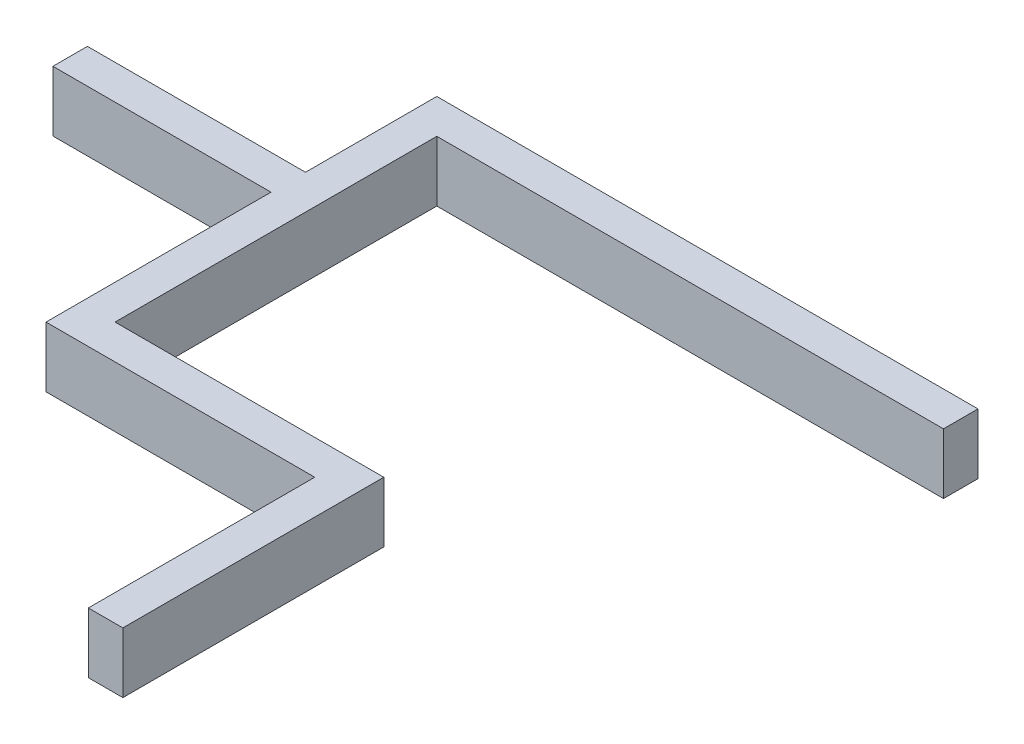
ISO-10303-21;
HEADER;
FILE_DESCRIPTION(('STEP AP214'),'2;1');
FILE_NAME('part.step','',(''),(''),'','','');
FILE_SCHEMA(('AUTOMOTIVE_DESIGN { 1 0 10303 214 1 1 1 1 }'));
ENDSEC;
DATA;
#1=APPLICATION_CONTEXT('core data for automotive mechanical design processes');
#2=APPLICATION_PROTOCOL_DEFINITION('international standard','automotive_design',2000,#1);
#3=PRODUCT_CONTEXT('',#1,'mechanical');
#4=PRODUCT('Part','Part','',(#3));
#5=PRODUCT_RELATED_PRODUCT_CATEGORY('part','',(#4));
#6=PRODUCT_DEFINITION_FORMATION('','',#4);
#7=PRODUCT_DEFINITION_CONTEXT('part definition',#1,'design');
#8=PRODUCT_DEFINITION('design','',#6,#7);
#9=PRODUCT_DEFINITION_SHAPE('','',#8);
#10=(LENGTH_UNIT() NAMED_UNIT(*) SI_UNIT(.MILLI.,.METRE.));
#11=(NAMED_UNIT(*) PLANE_ANGLE_UNIT() SI_UNIT($,.RADIAN.));
#12=(NAMED_UNIT(*) SI_UNIT($,.STERADIAN.) SOLID_ANGLE_UNIT());
#13=UNCERTAINTY_MEASURE_WITH_UNIT(LENGTH_MEASURE(1.E-05),#10,'distance_accuracy_value','');
#14=(GEOMETRIC_REPRESENTATION_CONTEXT(3) GLOBAL_UNCERTAINTY_ASSIGNED_CONTEXT((#13)) GLOBAL_UNIT_ASSIGNED_CONTEXT((#10,
#11,#12)) REPRESENTATION_CONTEXT('',''));
#15=CARTESIAN_POINT('',(0.,0.,0.));
#16=DIRECTION('',(0.,0.,1.));
#17=DIRECTION('',(1.,0.,0.));
#18=AXIS2_PLACEMENT_3D('',#15,#16,#17);
#19=CARTESIAN_POINT('',(77.2931425865469,8.5,3.47679166005444));
#20=DIRECTION('',(1.,0.,0.));
#21=DIRECTION('',(0.,0.,-1.));
#22=AXIS2_PLACEMENT_3D('',#19,#20,#21);
#23=PLANE('',#22);
#24=DIRECTION('',(0.,0.,1.));
#25=VECTOR('',#24,1.);
#26=CARTESIAN_POINT('',(77.2931425865469,1.5,3.47679166005444));
#27=LINE('',#26,#25);
#28=CARTESIAN_POINT('',(77.2931425865469,1.5,-11.7372666128108));
#29=VERTEX_POINT('',#28);
#30=CARTESIAN_POINT('',(77.2931425865469,1.5,3.47679166005444));
#31=VERTEX_POINT('',#30);
#32=EDGE_CURVE('E230',#29,#31,#27,.T.);
#33=ORIENTED_EDGE('',*,*,#32,.T.);
#34=DIRECTION('',(0.,-1.,0.));
#35=VECTOR('',#34,1.);
#36=CARTESIAN_POINT('',(77.2931425865469,8.5,3.47679166005444));
#37=LINE('',#36,#35);
#38=CARTESIAN_POINT('',(77.2931425865469,8.5,3.47679166005444));
#39=VERTEX_POINT('',#38);
#40=EDGE_CURVE('E194',#39,#31,#37,.T.);
#41=ORIENTED_EDGE('',*,*,#40,.F.);
#42=DIRECTION('',(0.,0.,1.));
#43=VECTOR('',#42,1.);
#44=CARTESIAN_POINT('',(77.2931425865469,8.5,3.47679166005444));
#45=LINE('',#44,#43);
#46=CARTESIAN_POINT('',(77.2931425865469,8.5,-11.7372666128108));
#47=VERTEX_POINT('',#46);
#48=EDGE_CURVE('E204',#47,#39,#45,.T.);
#49=ORIENTED_EDGE('',*,*,#48,.F.);
#50=DIRECTION('',(0.,-1.,0.));
#51=VECTOR('',#50,1.);
#52=CARTESIAN_POINT('',(77.2931425865469,8.5,-11.7372666128108));
#53=LINE('',#52,#51);
#54=EDGE_CURVE('E197',#47,#29,#53,.T.);
#55=ORIENTED_EDGE('',*,*,#54,.T.);
#56=EDGE_LOOP('',(#33,#41,#49,#55));
#57=FACE_BOUND('',#56,.T.);
#58=ADVANCED_FACE('F45',(#57),#23,.F.);
#59=CARTESIAN_POINT('',(52.0277518293071,8.5,3.47679166005444));
#60=DIRECTION('',(0.,0.,1.));
#61=DIRECTION('',(1.,0.,0.));
#62=AXIS2_PLACEMENT_3D('',#59,#60,#61);
#63=PLANE('',#62);
#64=DIRECTION('',(-1.,0.,0.));
#65=VECTOR('',#64,1.);
#66=CARTESIAN_POINT('',(52.0277518293071,1.5,3.47679166005444));
#67=LINE('',#66,#65);
#68=CARTESIAN_POINT('',(52.0277518293071,1.5,3.47679166005444));
#69=VERTEX_POINT('',#68);
#70=EDGE_CURVE('E233',#31,#69,#67,.T.);
#71=ORIENTED_EDGE('',*,*,#70,.T.);
#72=DIRECTION('',(0.,-1.,0.));
#73=VECTOR('',#72,1.);
#74=CARTESIAN_POINT('',(52.0277518293071,8.5,3.47679166005444));
#75=LINE('',#74,#73);
#76=CARTESIAN_POINT('',(52.0277518293071,8.5,3.47679166005444));
#77=VERTEX_POINT('',#76);
#78=EDGE_CURVE('E191',#77,#69,#75,.T.);
#79=ORIENTED_EDGE('',*,*,#78,.F.);
#80=DIRECTION('',(-1.,0.,0.));
#81=VECTOR('',#80,1.);
#82=CARTESIAN_POINT('',(52.0277518293071,8.5,3.47679166005444));
#83=LINE('',#82,#81);
#84=EDGE_CURVE('E210',#39,#77,#83,.T.);
#85=ORIENTED_EDGE('',*,*,#84,.F.);
#86=ORIENTED_EDGE('',*,*,#40,.T.);
#87=EDGE_LOOP('',(#71,#79,#85,#86));
#88=FACE_BOUND('',#87,.T.);
#89=ADVANCED_FACE('F296',(#88),#63,.F.);
#90=CARTESIAN_POINT('',(52.0277518293071,8.5,7.47679166005445));
#91=DIRECTION('',(1.,0.,0.));
#92=DIRECTION('',(0.,0.,-1.));
#93=AXIS2_PLACEMENT_3D('',#90,#91,#92);
#94=PLANE('',#93);
#95=DIRECTION('',(0.,0.,1.));
#96=VECTOR('',#95,1.);
#97=CARTESIAN_POINT('',(52.0277518293071,1.5,7.47679166005445));
#98=LINE('',#97,#96);
#99=CARTESIAN_POINT('',(52.0277518293071,1.5,7.47679166005445));
#100=VERTEX_POINT('',#99);
#101=EDGE_CURVE('E236',#69,#100,#98,.T.);
#102=ORIENTED_EDGE('',*,*,#101,.T.);
#103=DIRECTION('',(0.,-1.,0.));
#104=VECTOR('',#103,1.);
#105=CARTESIAN_POINT('',(52.0277518293071,8.5,7.47679166005445));
#106=LINE('',#105,#104);
#107=CARTESIAN_POINT('',(52.0277518293071,8.5,7.47679166005445));
#108=VERTEX_POINT('',#107);
#109=EDGE_CURVE('E188',#108,#100,#106,.T.);
#110=ORIENTED_EDGE('',*,*,#109,.F.);
#111=DIRECTION('',(0.,0.,1.));
#112=VECTOR('',#111,1.);
#113=CARTESIAN_POINT('',(52.0277518293071,8.5,7.47679166005445));
#114=LINE('',#113,#112);
#115=EDGE_CURVE('E212',#77,#108,#114,.T.);
#116=ORIENTED_EDGE('',*,*,#115,.F.);
#117=ORIENTED_EDGE('',*,*,#78,.T.);
#118=EDGE_LOOP('',(#102,#110,#116,#117));
#119=FACE_BOUND('',#118,.T.);
#120=ADVANCED_FACE('F293',(#119),#94,.F.);
#121=CARTESIAN_POINT('',(77.2931425865469,8.5,7.47679166005444));
#122=DIRECTION('',(0.,0.,-1.));
#123=DIRECTION('',(-1.,0.,0.));
#124=AXIS2_PLACEMENT_3D('',#121,#122,#123);
#125=PLANE('',#124);
#126=DIRECTION('',(1.,0.,0.));
#127=VECTOR('',#126,1.);
#128=CARTESIAN_POINT('',(77.2931425865469,1.5,7.47679166005444));
#129=LINE('',#128,#127);
#130=CARTESIAN_POINT('',(77.2931425865469,1.5,7.47679166005444));
#131=VERTEX_POINT('',#130);
#132=EDGE_CURVE('E239',#100,#131,#129,.T.);
#133=ORIENTED_EDGE('',*,*,#132,.T.);
#134=DIRECTION('',(0.,-1.,0.));
#135=VECTOR('',#134,1.);
#136=CARTESIAN_POINT('',(77.2931425865469,8.5,7.47679166005444));
#137=LINE('',#136,#135);
#138=CARTESIAN_POINT('',(77.2931425865469,8.5,7.47679166005444));
#139=VERTEX_POINT('',#138);
#140=EDGE_CURVE('E185',#139,#131,#137,.T.);
#141=ORIENTED_EDGE('',*,*,#140,.F.);
#142=DIRECTION('',(1.,0.,0.));
#143=VECTOR('',#142,1.);
#144=CARTESIAN_POINT('',(77.2931425865469,8.5,7.47679166005444));
#145=LINE('',#144,#143);
#146=EDGE_CURVE('E214',#108,#139,#145,.T.);
#147=ORIENTED_EDGE('',*,*,#146,.F.);
#148=ORIENTED_EDGE('',*,*,#109,.T.);
#149=EDGE_LOOP('',(#133,#141,#147,#148));
#150=FACE_BOUND('',#149,.T.);
#151=ADVANCED_FACE('F288',(#150),#125,.F.);
#152=CARTESIAN_POINT('',(77.2931425865469,8.5,33.5435448342302));
#153=DIRECTION('',(1.,0.,0.));
#154=DIRECTION('',(0.,0.,-1.));
#155=AXIS2_PLACEMENT_3D('',#152,#153,#154);
#156=PLANE('',#155);
#157=DIRECTION('',(0.,0.,1.));
#158=VECTOR('',#157,1.);
#159=CARTESIAN_POINT('',(77.2931425865469,1.5,33.5435448342302));
#160=LINE('',#159,#158);
#161=CARTESIAN_POINT('',(77.2931425865469,1.5,33.5435448342302));
#162=VERTEX_POINT('',#161);
#163=EDGE_CURVE('E242',#131,#162,#160,.T.);
#164=ORIENTED_EDGE('',*,*,#163,.T.);
#165=DIRECTION('',(0.,-1.,0.));
#166=VECTOR('',#165,1.);
#167=CARTESIAN_POINT('',(77.2931425865469,8.5,33.5435448342302));
#168=LINE('',#167,#166);
#169=CARTESIAN_POINT('',(77.2931425865469,8.5,33.5435448342302));
#170=VERTEX_POINT('',#169);
#171=EDGE_CURVE('E182',#170,#162,#168,.T.);
#172=ORIENTED_EDGE('',*,*,#171,.F.);
#173=DIRECTION('',(0.,0.,1.));
#174=VECTOR('',#173,1.);
#175=CARTESIAN_POINT('',(77.2931425865469,8.5,33.5435448342302));
#176=LINE('',#175,#174);
#177=EDGE_CURVE('E216',#139,#170,#176,.T.);
#178=ORIENTED_EDGE('',*,*,#177,.F.);
#179=ORIENTED_EDGE('',*,*,#140,.T.);
#180=EDGE_LOOP('',(#164,#172,#178,#179));
#181=FACE_BOUND('',#180,.T.);
#182=ADVANCED_FACE('F285',(#181),#156,.F.);
#183=CARTESIAN_POINT('',(108.431248518344,8.5,33.5435448342302));
#184=DIRECTION('',(0.,0.,-1.));
#185=DIRECTION('',(-1.,0.,0.));
#186=AXIS2_PLACEMENT_3D('',#183,#184,#185);
#187=PLANE('',#186);
#188=DIRECTION('',(1.,0.,0.));
#189=VECTOR('',#188,1.);
#190=CARTESIAN_POINT('',(108.431248518344,1.5,33.5435448342302));
#191=LINE('',#190,#189);
#192=CARTESIAN_POINT('',(108.431248518344,1.5,33.5435448342302));
#193=VERTEX_POINT('',#192);
#194=EDGE_CURVE('E245',#162,#193,#191,.T.);
#195=ORIENTED_EDGE('',*,*,#194,.T.);
#196=DIRECTION('',(0.,-1.,0.));
#197=VECTOR('',#196,1.);
#198=CARTESIAN_POINT('',(108.431248518344,8.5,33.5435448342302));
#199=LINE('',#198,#197);
#200=CARTESIAN_POINT('',(108.431248518344,8.5,33.5435448342302));
#201=VERTEX_POINT('',#200);
#202=EDGE_CURVE('E179',#201,#193,#199,.T.);
#203=ORIENTED_EDGE('',*,*,#202,.F.);
#204=DIRECTION('',(1.,0.,0.));
#205=VECTOR('',#204,1.);
#206=CARTESIAN_POINT('',(108.431248518344,8.5,33.5435448342302));
#207=LINE('',#206,#205);
#208=EDGE_CURVE('E218',#170,#201,#207,.T.);
#209=ORIENTED_EDGE('',*,*,#208,.F.);
#210=ORIENTED_EDGE('',*,*,#171,.T.);
#211=EDGE_LOOP('',(#195,#203,#209,#210));
#212=FACE_BOUND('',#211,.T.);
#213=ADVANCED_FACE('F280',(#212),#187,.F.);
#214=CARTESIAN_POINT('',(108.431248518344,8.5,59.7772729736788));
#215=DIRECTION('',(1.,0.,0.));
#216=DIRECTION('',(0.,0.,-1.));
#217=AXIS2_PLACEMENT_3D('',#214,#215,#216);
#218=PLANE('',#217);
#219=DIRECTION('',(0.,0.,1.));
#220=VECTOR('',#219,1.);
#221=CARTESIAN_POINT('',(108.431248518344,1.5,59.7772729736788));
#222=LINE('',#221,#220);
#223=CARTESIAN_POINT('',(108.431248518344,1.5,59.7772729736788));
#224=VERTEX_POINT('',#223);
#225=EDGE_CURVE('E248',#193,#224,#222,.T.);
#226=ORIENTED_EDGE('',*,*,#225,.T.);
#227=DIRECTION('',(0.,-1.,0.));
#228=VECTOR('',#227,1.);
#229=CARTESIAN_POINT('',(108.431248518344,8.5,59.7772729736788));
#230=LINE('',#229,#228);
#231=CARTESIAN_POINT('',(108.431248518344,8.5,59.7772729736788));
#232=VERTEX_POINT('',#231);
#233=EDGE_CURVE('E176',#232,#224,#230,.T.);
#234=ORIENTED_EDGE('',*,*,#233,.F.);
#235=DIRECTION('',(0.,0.,1.));
#236=VECTOR('',#235,1.);
#237=CARTESIAN_POINT('',(108.431248518344,8.5,59.7772729736788));
#238=LINE('',#237,#236);
#239=EDGE_CURVE('E220',#201,#232,#238,.T.);
#240=ORIENTED_EDGE('',*,*,#239,.F.);
#241=ORIENTED_EDGE('',*,*,#202,.T.);
#242=EDGE_LOOP('',(#226,#234,#240,#241));
#243=FACE_BOUND('',#242,.T.);
#244=ADVANCED_FACE('F277',(#243),#218,.F.);
#245=CARTESIAN_POINT('',(112.431248518344,8.5,59.7772729736788));
#246=DIRECTION('',(0.,0.,-1.));
#247=DIRECTION('',(-1.,0.,0.));
#248=AXIS2_PLACEMENT_3D('',#245,#246,#247);
#249=PLANE('',#248);
#250=DIRECTION('',(1.,0.,0.));
#251=VECTOR('',#250,1.);
#252=CARTESIAN_POINT('',(112.431248518344,1.5,59.7772729736788));
#253=LINE('',#252,#251);
#254=CARTESIAN_POINT('',(112.431248518344,1.5,59.7772729736788));
#255=VERTEX_POINT('',#254);
#256=EDGE_CURVE('E251',#224,#255,#253,.T.);
#257=ORIENTED_EDGE('',*,*,#256,.T.);
#258=DIRECTION('',(0.,-1.,0.));
#259=VECTOR('',#258,1.);
#260=CARTESIAN_POINT('',(112.431248518344,8.5,59.7772729736788));
#261=LINE('',#260,#259);
#262=CARTESIAN_POINT('',(112.431248518344,8.5,59.7772729736788));
#263=VERTEX_POINT('',#262);
#264=EDGE_CURVE('E173',#263,#255,#261,.T.);
#265=ORIENTED_EDGE('',*,*,#264,.F.);
#266=DIRECTION('',(1.,0.,0.));
#267=VECTOR('',#266,1.);
#268=CARTESIAN_POINT('',(112.431248518344,8.5,59.7772729736788));
#269=LINE('',#268,#267);
#270=EDGE_CURVE('E222',#232,#263,#269,.T.);
#271=ORIENTED_EDGE('',*,*,#270,.F.);
#272=ORIENTED_EDGE('',*,*,#233,.T.);
#273=EDGE_LOOP('',(#257,#265,#271,#272));
#274=FACE_BOUND('',#273,.T.);
#275=ADVANCED_FACE('F272',(#274),#249,.F.);
#276=CARTESIAN_POINT('',(112.431248518344,8.5,29.5435448342302));
#277=DIRECTION('',(-1.,0.,0.));
#278=DIRECTION('',(0.,0.,1.));
#279=AXIS2_PLACEMENT_3D('',#276,#277,#278);
#280=PLANE('',#279);
#281=DIRECTION('',(0.,0.,-1.));
#282=VECTOR('',#281,1.);
#283=CARTESIAN_POINT('',(112.431248518344,1.5,29.5435448342302));
#284=LINE('',#283,#282);
#285=CARTESIAN_POINT('',(112.431248518344,1.5,29.5435448342302));
#286=VERTEX_POINT('',#285);
#287=EDGE_CURVE('E254',#255,#286,#284,.T.);
#288=ORIENTED_EDGE('',*,*,#287,.T.);
#289=DIRECTION('',(0.,-1.,0.));
#290=VECTOR('',#289,1.);
#291=CARTESIAN_POINT('',(112.431248518344,8.5,29.5435448342302));
#292=LINE('',#291,#290);
#293=CARTESIAN_POINT('',(112.431248518344,8.5,29.5435448342302));
#294=VERTEX_POINT('',#293);
#295=EDGE_CURVE('E170',#294,#286,#292,.T.);
#296=ORIENTED_EDGE('',*,*,#295,.F.);
#297=DIRECTION('',(0.,0.,-1.));
#298=VECTOR('',#297,1.);
#299=CARTESIAN_POINT('',(112.431248518344,8.5,29.5435448342302));
#300=LINE('',#299,#298);
#301=EDGE_CURVE('E224',#263,#294,#300,.T.);
#302=ORIENTED_EDGE('',*,*,#301,.F.);
#303=ORIENTED_EDGE('',*,*,#264,.T.);
#304=EDGE_LOOP('',(#288,#296,#302,#303));
#305=FACE_BOUND('',#304,.T.);
#306=ADVANCED_FACE('F269',(#305),#280,.F.);
#307=CARTESIAN_POINT('',(81.2931425865469,8.5,29.5435448342302));
#308=DIRECTION('',(0.,0.,1.));
#309=DIRECTION('',(1.,0.,0.));
#310=AXIS2_PLACEMENT_3D('',#307,#308,#309);
#311=PLANE('',#310);
#312=DIRECTION('',(-1.,0.,0.));
#313=VECTOR('',#312,1.);
#314=CARTESIAN_POINT('',(81.2931425865469,1.5,29.5435448342302));
#315=LINE('',#314,#313);
#316=CARTESIAN_POINT('',(81.2931425865469,1.5,29.5435448342302));
#317=VERTEX_POINT('',#316);
#318=EDGE_CURVE('E257',#286,#317,#315,.T.);
#319=ORIENTED_EDGE('',*,*,#318,.T.);
#320=DIRECTION('',(0.,-1.,0.));
#321=VECTOR('',#320,1.);
#322=CARTESIAN_POINT('',(81.2931425865469,8.5,29.5435448342302));
#323=LINE('',#322,#321);
#324=CARTESIAN_POINT('',(81.2931425865469,8.5,29.5435448342302));
#325=VERTEX_POINT('',#324);
#326=EDGE_CURVE('E162',#325,#317,#323,.T.);
#327=ORIENTED_EDGE('',*,*,#326,.F.);
#328=DIRECTION('',(-1.,0.,0.));
#329=VECTOR('',#328,1.);
#330=CARTESIAN_POINT('',(81.2931425865469,8.5,29.5435448342302));
#331=LINE('',#330,#329);
#332=EDGE_CURVE('E226',#294,#325,#331,.T.);
#333=ORIENTED_EDGE('',*,*,#332,.F.);
#334=ORIENTED_EDGE('',*,*,#295,.T.);
#335=EDGE_LOOP('',(#319,#327,#333,#334));
#336=FACE_BOUND('',#335,.T.);
#337=ADVANCED_FACE('F264',(#336),#311,.F.);
#338=CARTESIAN_POINT('',(81.2931425865469,8.5,-7.73726661281077));
#339=DIRECTION('',(-1.,0.,0.));
#340=DIRECTION('',(0.,0.,1.));
#341=AXIS2_PLACEMENT_3D('',#338,#339,#340);
#342=PLANE('',#341);
#343=DIRECTION('',(0.,0.,-1.));
#344=VECTOR('',#343,1.);
#345=CARTESIAN_POINT('',(81.2931425865469,1.5,-7.73726661281077));
#346=LINE('',#345,#344);
#347=CARTESIAN_POINT('',(81.2931425865469,1.5,-7.73726661281077));
#348=VERTEX_POINT('',#347);
#349=EDGE_CURVE('E159',#317,#348,#346,.T.);
#350=ORIENTED_EDGE('',*,*,#349,.T.);
#351=DIRECTION('',(0.,-1.,0.));
#352=VECTOR('',#351,1.);
#353=CARTESIAN_POINT('',(81.2931425865469,8.5,-7.73726661281077));
#354=LINE('',#353,#352);
#355=CARTESIAN_POINT('',(81.2931425865469,8.5,-7.73726661281077));
#356=VERTEX_POINT('',#355);
#357=EDGE_CURVE('E157',#356,#348,#354,.T.);
#358=ORIENTED_EDGE('',*,*,#357,.F.);
#359=DIRECTION('',(0.,0.,-1.));
#360=VECTOR('',#359,1.);
#361=CARTESIAN_POINT('',(81.2931425865469,8.5,-7.73726661281077));
#362=LINE('',#361,#360);
#363=EDGE_CURVE('E164',#325,#356,#362,.T.);
#364=ORIENTED_EDGE('',*,*,#363,.F.);
#365=ORIENTED_EDGE('',*,*,#326,.T.);
#366=EDGE_LOOP('',(#350,#358,#364,#365));
#367=FACE_BOUND('',#366,.T.);
#368=ADVANCED_FACE('F260',(#367),#342,.F.);
#369=CARTESIAN_POINT('',(140.,8.5,-7.73726661281078));
#370=DIRECTION('',(0.,0.,-1.));
#371=DIRECTION('',(-1.,0.,0.));
#372=AXIS2_PLACEMENT_3D('',#369,#370,#371);
#373=PLANE('',#372);
#374=DIRECTION('',(1.,0.,0.));
#375=VECTOR('',#374,1.);
#376=CARTESIAN_POINT('',(140.,1.5,-7.73726661281078));
#377=LINE('',#376,#375);
#378=CARTESIAN_POINT('',(140.,1.5,-7.73726661281077));
#379=VERTEX_POINT('',#378);
#380=EDGE_CURVE('E143',#348,#379,#377,.T.);
#381=ORIENTED_EDGE('',*,*,#380,.T.);
#382=DIRECTION('',(0.,-1.,0.));
#383=VECTOR('',#382,1.);
#384=CARTESIAN_POINT('',(140.,8.5,-7.73726661281078));
#385=LINE('',#384,#383);
#386=CARTESIAN_POINT('',(140.,8.5,-7.73726661281078));
#387=VERTEX_POINT('',#386);
#388=EDGE_CURVE('E154',#387,#379,#385,.T.);
#389=ORIENTED_EDGE('',*,*,#388,.F.);
#390=DIRECTION('',(1.,0.,0.));
#391=VECTOR('',#390,1.);
#392=CARTESIAN_POINT('',(140.,8.5,-7.73726661281078));
#393=LINE('',#392,#391);
#394=EDGE_CURVE('E61',#356,#387,#393,.T.);
#395=ORIENTED_EDGE('',*,*,#394,.F.);
#396=ORIENTED_EDGE('',*,*,#357,.T.);
#397=EDGE_LOOP('',(#381,#389,#395,#396));
#398=FACE_BOUND('',#397,.T.);
#399=ADVANCED_FACE('F153',(#398),#373,.F.);
#400=CARTESIAN_POINT('',(0.,8.5,0.));
#401=DIRECTION('',(0.,-1.,0.));
#402=DIRECTION('',(0.,0.,-1.));
#403=AXIS2_PLACEMENT_3D('',#400,#401,#402);
#404=PLANE('',#403);
#405=DIRECTION('',(0.,0.,-1.));
#406=VECTOR('',#405,1.);
#407=CARTESIAN_POINT('',(140.,8.5,-11.7372666128108));
#408=LINE('',#407,#406);
#409=CARTESIAN_POINT('',(140.,8.5,-11.7372666128108));
#410=VERTEX_POINT('',#409);
#411=EDGE_CURVE('E158',#387,#410,#408,.T.);
#412=ORIENTED_EDGE('',*,*,#411,.T.);
#413=DIRECTION('',(-1.,0.,0.));
#414=VECTOR('',#413,1.);
#415=CARTESIAN_POINT('',(77.2931425865469,8.5,-11.7372666128108));
#416=LINE('',#415,#414);
#417=EDGE_CURVE('E202',#410,#47,#416,.T.);
#418=ORIENTED_EDGE('',*,*,#417,.T.);
#419=ORIENTED_EDGE('',*,*,#48,.T.);
#420=ORIENTED_EDGE('',*,*,#84,.T.);
#421=ORIENTED_EDGE('',*,*,#115,.T.);
#422=ORIENTED_EDGE('',*,*,#146,.T.);
#423=ORIENTED_EDGE('',*,*,#177,.T.);
#424=ORIENTED_EDGE('',*,*,#208,.T.);
#425=ORIENTED_EDGE('',*,*,#239,.T.);
#426=ORIENTED_EDGE('',*,*,#270,.T.);
#427=ORIENTED_EDGE('',*,*,#301,.T.);
#428=ORIENTED_EDGE('',*,*,#332,.T.);
#429=ORIENTED_EDGE('',*,*,#363,.T.);
#430=ORIENTED_EDGE('',*,*,#394,.T.);
#431=EDGE_LOOP('',(#412,#418,#419,#420,#421,#422,#423,#424,#425,#426,#427,#428,#429,#430));
#432=FACE_BOUND('',#431,.T.);
#433=ADVANCED_FACE('F206',(#432),#404,.F.);
#434=CARTESIAN_POINT('',(77.2931425865469,8.5,-11.7372666128108));
#435=DIRECTION('',(0.,0.,1.));
#436=DIRECTION('',(1.,0.,0.));
#437=AXIS2_PLACEMENT_3D('',#434,#435,#436);
#438=PLANE('',#437);
#439=DIRECTION('',(-1.,0.,0.));
#440=VECTOR('',#439,1.);
#441=CARTESIAN_POINT('',(77.2931425865469,1.5,-11.7372666128108));
#442=LINE('',#441,#440);
#443=CARTESIAN_POINT('',(140.,1.5,-11.7372666128108));
#444=VERTEX_POINT('',#443);
#445=EDGE_CURVE('E146',#444,#29,#442,.T.);
#446=ORIENTED_EDGE('',*,*,#445,.T.);
#447=ORIENTED_EDGE('',*,*,#54,.F.);
#448=ORIENTED_EDGE('',*,*,#417,.F.);
#449=DIRECTION('',(0.,-1.,0.));
#450=VECTOR('',#449,1.);
#451=CARTESIAN_POINT('',(140.,8.5,-11.7372666128108));
#452=LINE('',#451,#450);
#453=EDGE_CURVE('E54',#410,#444,#452,.T.);
#454=ORIENTED_EDGE('',*,*,#453,.T.);
#455=EDGE_LOOP('',(#446,#447,#448,#454));
#456=FACE_BOUND('',#455,.T.);
#457=ADVANCED_FACE('F200',(#456),#438,.F.);
#458=CARTESIAN_POINT('',(140.,1.5,140.));
#459=DIRECTION('',(-1.,0.,0.));
#460=DIRECTION('',(0.,0.,1.));
#461=AXIS2_PLACEMENT_3D('',#458,#459,#460);
#462=PLANE('',#461);
#463=ORIENTED_EDGE('',*,*,#388,.T.);
#464=DIRECTION('',(0.,0.,-1.));
#465=VECTOR('',#464,1.);
#466=CARTESIAN_POINT('',(140.,1.5,140.));
#467=LINE('',#466,#465);
#468=EDGE_CURVE('E11',#379,#444,#467,.T.);
#469=ORIENTED_EDGE('',*,*,#468,.T.);
#470=ORIENTED_EDGE('',*,*,#453,.F.);
#471=ORIENTED_EDGE('',*,*,#411,.F.);
#472=EDGE_LOOP('',(#463,#469,#470,#471));
#473=FACE_BOUND('',#472,.T.);
#474=ADVANCED_FACE('F47',(#473),#462,.F.);
#475=CARTESIAN_POINT('',(51.0585368122691,1.5,-29.4736028503928));
#476=DIRECTION('',(0.,1.,0.));
#477=DIRECTION('',(0.,0.,1.));
#478=AXIS2_PLACEMENT_3D('',#475,#476,#477);
#479=PLANE('',#478);
#480=ORIENTED_EDGE('',*,*,#349,.F.);
#481=ORIENTED_EDGE('',*,*,#318,.F.);
#482=ORIENTED_EDGE('',*,*,#287,.F.);
#483=ORIENTED_EDGE('',*,*,#256,.F.);
#484=ORIENTED_EDGE('',*,*,#225,.F.);
#485=ORIENTED_EDGE('',*,*,#194,.F.);
#486=ORIENTED_EDGE('',*,*,#163,.F.);
#487=ORIENTED_EDGE('',*,*,#132,.F.);
#488=ORIENTED_EDGE('',*,*,#101,.F.);
#489=ORIENTED_EDGE('',*,*,#70,.F.);
#490=ORIENTED_EDGE('',*,*,#32,.F.);
#491=ORIENTED_EDGE('',*,*,#445,.F.);
#492=ORIENTED_EDGE('',*,*,#468,.F.);
#493=ORIENTED_EDGE('',*,*,#380,.F.);
#494=EDGE_LOOP('',(#480,#481,#482,#483,#484,#485,#486,#487,#488,#489,#490,#491,#492,#493));
#495=FACE_BOUND('',#494,.T.);
#496=ADVANCED_FACE('F142',(#495),#479,.F.);
#497=CLOSED_SHELL('',(#58,#89,#120,#151,#182,#213,#244,#275,#306,#337,#368,#399,#433,#457,#474,#496));
#498=MANIFOLD_SOLID_BREP('B2',#497);
#499=ADVANCED_BREP_SHAPE_REPRESENTATION('',(#18,#498),#14);
#500=SHAPE_DEFINITION_REPRESENTATION(#9,#499);
ENDSEC;
END-ISO-10303-21;
